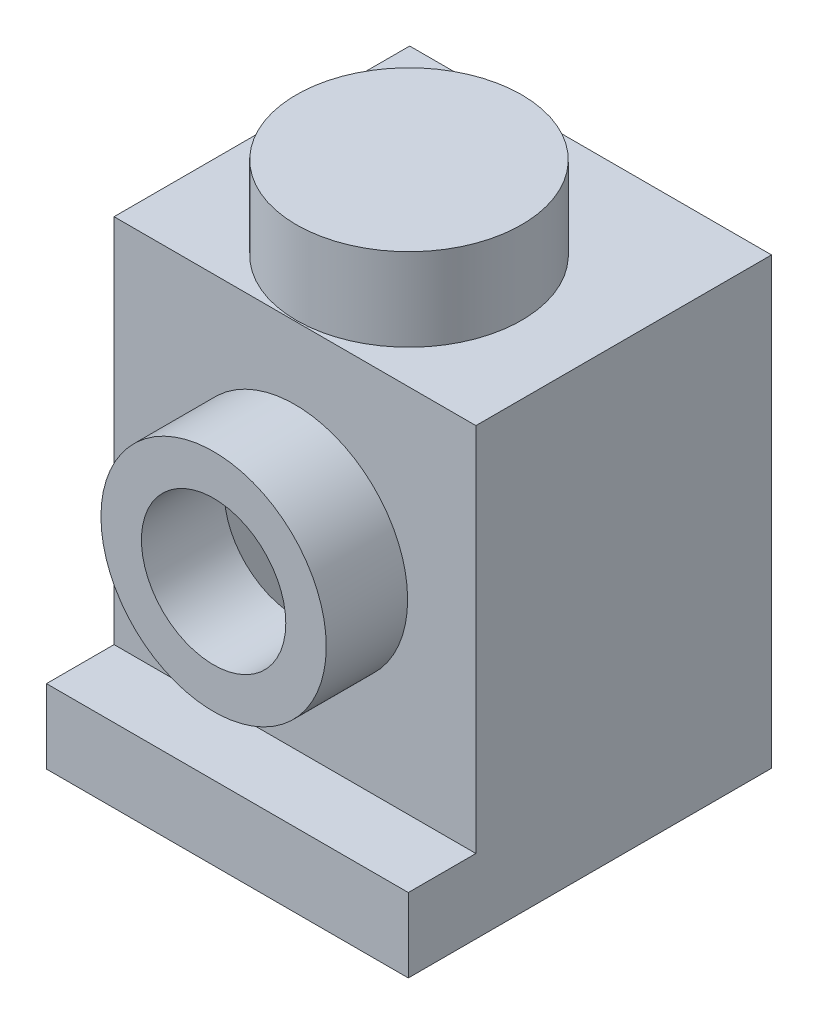
ISO-10303-21;
HEADER;
FILE_DESCRIPTION(('STEP AP214'),'2;1');
FILE_NAME('part.step','',(''),(''),'','','');
FILE_SCHEMA(('AUTOMOTIVE_DESIGN { 1 0 10303 214 1 1 1 1 }'));
ENDSEC;
DATA;
#1=APPLICATION_CONTEXT('core data for automotive mechanical design processes');
#2=APPLICATION_PROTOCOL_DEFINITION('international standard','automotive_design',2000,#1);
#3=PRODUCT_CONTEXT('',#1,'mechanical');
#4=PRODUCT('Part','Part','',(#3));
#5=PRODUCT_RELATED_PRODUCT_CATEGORY('part','',(#4));
#6=PRODUCT_DEFINITION_FORMATION('','',#4);
#7=PRODUCT_DEFINITION_CONTEXT('part definition',#1,'design');
#8=PRODUCT_DEFINITION('design','',#6,#7);
#9=PRODUCT_DEFINITION_SHAPE('','',#8);
#10=(LENGTH_UNIT() NAMED_UNIT(*) SI_UNIT(.MILLI.,.METRE.));
#11=(NAMED_UNIT(*) PLANE_ANGLE_UNIT() SI_UNIT($,.RADIAN.));
#12=(NAMED_UNIT(*) SI_UNIT($,.STERADIAN.) SOLID_ANGLE_UNIT());
#13=UNCERTAINTY_MEASURE_WITH_UNIT(LENGTH_MEASURE(1.E-05),#10,'distance_accuracy_value','');
#14=(GEOMETRIC_REPRESENTATION_CONTEXT(3) GLOBAL_UNCERTAINTY_ASSIGNED_CONTEXT((#13)) GLOBAL_UNIT_ASSIGNED_CONTEXT((#10,
#11,#12)) REPRESENTATION_CONTEXT('',''));
#15=CARTESIAN_POINT('',(0.,0.,0.));
#16=DIRECTION('',(0.,0.,1.));
#17=DIRECTION('',(1.,0.,0.));
#18=AXIS2_PLACEMENT_3D('',#15,#16,#17);
#19=CARTESIAN_POINT('',(-7.87,0.,7.9));
#20=DIRECTION('',(0.,-1.,0.));
#21=DIRECTION('',(0.,0.,-1.));
#22=AXIS2_PLACEMENT_3D('',#19,#20,#21);
#23=PLANE('',#22);
#24=DIRECTION('',(0.,0.,-1.));
#25=VECTOR('',#24,1.);
#26=CARTESIAN_POINT('',(-6.42,0.,1.5));
#27=LINE('',#26,#25);
#28=CARTESIAN_POINT('',(-6.42,0.,6.4));
#29=VERTEX_POINT('',#28);
#30=CARTESIAN_POINT('',(-6.42,0.,1.5));
#31=VERTEX_POINT('',#30);
#32=EDGE_CURVE('E48',#29,#31,#27,.T.);
#33=ORIENTED_EDGE('',*,*,#32,.F.);
#34=DIRECTION('',(-1.,0.,0.));
#35=VECTOR('',#34,1.);
#36=CARTESIAN_POINT('',(-6.42,0.,6.4));
#37=LINE('',#36,#35);
#38=CARTESIAN_POINT('',(-1.45,0.,6.4));
#39=VERTEX_POINT('',#38);
#40=EDGE_CURVE('E153',#39,#29,#37,.T.);
#41=ORIENTED_EDGE('',*,*,#40,.F.);
#42=DIRECTION('',(0.,0.,1.));
#43=VECTOR('',#42,1.);
#44=CARTESIAN_POINT('',(-1.45,0.,6.4));
#45=LINE('',#44,#43);
#46=CARTESIAN_POINT('',(-1.45,0.,1.5));
#47=VERTEX_POINT('',#46);
#48=EDGE_CURVE('E156',#47,#39,#45,.T.);
#49=ORIENTED_EDGE('',*,*,#48,.F.);
#50=DIRECTION('',(1.,0.,0.));
#51=VECTOR('',#50,1.);
#52=CARTESIAN_POINT('',(-1.45,0.,1.5));
#53=LINE('',#52,#51);
#54=EDGE_CURVE('E165',#31,#47,#53,.T.);
#55=ORIENTED_EDGE('',*,*,#54,.F.);
#56=EDGE_LOOP('',(#33,#41,#49,#55));
#57=FACE_BOUND('',#56,.T.);
#58=DIRECTION('',(0.,0.,-1.));
#59=VECTOR('',#58,1.);
#60=CARTESIAN_POINT('',(0.,0.,7.9));
#61=LINE('',#60,#59);
#62=CARTESIAN_POINT('',(0.,0.,7.9));
#63=VERTEX_POINT('',#62);
#64=CARTESIAN_POINT('',(0.,0.,0.));
#65=VERTEX_POINT('',#64);
#66=EDGE_CURVE('E213',#63,#65,#61,.T.);
#67=ORIENTED_EDGE('',*,*,#66,.F.);
#68=DIRECTION('',(1.,0.,0.));
#69=VECTOR('',#68,1.);
#70=CARTESIAN_POINT('',(-7.87,0.,7.9));
#71=LINE('',#70,#69);
#72=CARTESIAN_POINT('',(-7.87,0.,7.9));
#73=VERTEX_POINT('',#72);
#74=EDGE_CURVE('E216',#73,#63,#71,.T.);
#75=ORIENTED_EDGE('',*,*,#74,.F.);
#76=DIRECTION('',(0.,0.,-1.));
#77=VECTOR('',#76,1.);
#78=CARTESIAN_POINT('',(-7.87,0.,7.9));
#79=LINE('',#78,#77);
#80=CARTESIAN_POINT('',(-7.87,0.,0.));
#81=VERTEX_POINT('',#80);
#82=EDGE_CURVE('E217',#73,#81,#79,.T.);
#83=ORIENTED_EDGE('',*,*,#82,.T.);
#84=DIRECTION('',(1.,0.,0.));
#85=VECTOR('',#84,1.);
#86=CARTESIAN_POINT('',(-7.87,0.,0.));
#87=LINE('',#86,#85);
#88=EDGE_CURVE('E236',#81,#65,#87,.T.);
#89=ORIENTED_EDGE('',*,*,#88,.T.);
#90=EDGE_LOOP('',(#67,#75,#83,#89));
#91=FACE_BOUND('',#90,.T.);
#92=ADVANCED_FACE('F33',(#57,#91),#23,.T.);
#93=CARTESIAN_POINT('',(-7.87,1.61,7.9));
#94=DIRECTION('',(0.,0.,1.));
#95=DIRECTION('',(1.,0.,0.));
#96=AXIS2_PLACEMENT_3D('',#93,#94,#95);
#97=PLANE('',#96);
#98=DIRECTION('',(0.,-1.,0.));
#99=VECTOR('',#98,1.);
#100=CARTESIAN_POINT('',(0.,1.61,7.9));
#101=LINE('',#100,#99);
#102=CARTESIAN_POINT('',(0.,1.61,7.9));
#103=VERTEX_POINT('',#102);
#104=EDGE_CURVE('E221',#103,#63,#101,.T.);
#105=ORIENTED_EDGE('',*,*,#104,.F.);
#106=DIRECTION('',(1.,0.,0.));
#107=VECTOR('',#106,1.);
#108=CARTESIAN_POINT('',(-7.87,1.61,7.9));
#109=LINE('',#108,#107);
#110=CARTESIAN_POINT('',(-7.87,1.61,7.9));
#111=VERTEX_POINT('',#110);
#112=EDGE_CURVE('E254',#111,#103,#109,.T.);
#113=ORIENTED_EDGE('',*,*,#112,.F.);
#114=DIRECTION('',(0.,-1.,0.));
#115=VECTOR('',#114,1.);
#116=CARTESIAN_POINT('',(-7.87,1.61,7.9));
#117=LINE('',#116,#115);
#118=EDGE_CURVE('E233',#111,#73,#117,.T.);
#119=ORIENTED_EDGE('',*,*,#118,.T.);
#120=ORIENTED_EDGE('',*,*,#74,.T.);
#121=EDGE_LOOP('',(#105,#113,#119,#120));
#122=FACE_BOUND('',#121,.T.);
#123=ADVANCED_FACE('F275',(#122),#97,.T.);
#124=CARTESIAN_POINT('',(-7.87,1.61,6.43));
#125=DIRECTION('',(0.,1.,0.));
#126=DIRECTION('',(0.,0.,1.));
#127=AXIS2_PLACEMENT_3D('',#124,#125,#126);
#128=PLANE('',#127);
#129=DIRECTION('',(0.,0.,1.));
#130=VECTOR('',#129,1.);
#131=CARTESIAN_POINT('',(0.,1.61,6.43));
#132=LINE('',#131,#130);
#133=CARTESIAN_POINT('',(0.,1.61,6.43));
#134=VERTEX_POINT('',#133);
#135=EDGE_CURVE('E248',#134,#103,#132,.T.);
#136=ORIENTED_EDGE('',*,*,#135,.F.);
#137=DIRECTION('',(1.,0.,0.));
#138=VECTOR('',#137,1.);
#139=CARTESIAN_POINT('',(-7.87,1.61,6.43));
#140=LINE('',#139,#138);
#141=CARTESIAN_POINT('',(-7.87,1.61,6.43));
#142=VERTEX_POINT('',#141);
#143=EDGE_CURVE('E256',#142,#134,#140,.T.);
#144=ORIENTED_EDGE('',*,*,#143,.F.);
#145=DIRECTION('',(0.,0.,1.));
#146=VECTOR('',#145,1.);
#147=CARTESIAN_POINT('',(-7.87,1.61,6.43));
#148=LINE('',#147,#146);
#149=EDGE_CURVE('E230',#142,#111,#148,.T.);
#150=ORIENTED_EDGE('',*,*,#149,.T.);
#151=ORIENTED_EDGE('',*,*,#112,.T.);
#152=EDGE_LOOP('',(#136,#144,#150,#151));
#153=FACE_BOUND('',#152,.T.);
#154=ADVANCED_FACE('F288',(#153),#128,.T.);
#155=CARTESIAN_POINT('',(-7.87,9.67,6.43));
#156=DIRECTION('',(0.,0.,1.));
#157=DIRECTION('',(0.,-1.,0.));
#158=AXIS2_PLACEMENT_3D('',#155,#156,#157);
#159=PLANE('',#158);
#160=CARTESIAN_POINT('',(-3.935,5.65,6.43));
#161=DIRECTION('',(0.,0.,1.));
#162=DIRECTION('',(1.,0.,0.));
#163=AXIS2_PLACEMENT_3D('',#160,#161,#162);
#164=CIRCLE('',#163,2.45);
#165=CARTESIAN_POINT('',(-1.485,5.65,6.43));
#166=VERTEX_POINT('',#165);
#167=EDGE_CURVE('E204',#166,#166,#164,.T.);
#168=ORIENTED_EDGE('',*,*,#167,.F.);
#169=EDGE_LOOP('',(#168));
#170=FACE_BOUND('',#169,.T.);
#171=DIRECTION('',(0.,-1.,0.));
#172=VECTOR('',#171,1.);
#173=CARTESIAN_POINT('',(0.,9.67,6.43));
#174=LINE('',#173,#172);
#175=CARTESIAN_POINT('',(0.,9.67,6.43));
#176=VERTEX_POINT('',#175);
#177=EDGE_CURVE('E245',#176,#134,#174,.T.);
#178=ORIENTED_EDGE('',*,*,#177,.F.);
#179=DIRECTION('',(1.,0.,0.));
#180=VECTOR('',#179,1.);
#181=CARTESIAN_POINT('',(-7.87,9.67,6.43));
#182=LINE('',#181,#180);
#183=CARTESIAN_POINT('',(-7.87,9.67,6.43));
#184=VERTEX_POINT('',#183);
#185=EDGE_CURVE('E258',#184,#176,#182,.T.);
#186=ORIENTED_EDGE('',*,*,#185,.F.);
#187=DIRECTION('',(0.,-1.,0.));
#188=VECTOR('',#187,1.);
#189=CARTESIAN_POINT('',(-7.87,9.67,6.43));
#190=LINE('',#189,#188);
#191=EDGE_CURVE('E227',#184,#142,#190,.T.);
#192=ORIENTED_EDGE('',*,*,#191,.T.);
#193=ORIENTED_EDGE('',*,*,#143,.T.);
#194=EDGE_LOOP('',(#178,#186,#192,#193));
#195=FACE_BOUND('',#194,.T.);
#196=ADVANCED_FACE('F286',(#170,#195),#159,.T.);
#197=CARTESIAN_POINT('',(-7.87,9.67,0.));
#198=DIRECTION('',(0.,1.,0.));
#199=DIRECTION('',(0.,0.,1.));
#200=AXIS2_PLACEMENT_3D('',#197,#198,#199);
#201=PLANE('',#200);
#202=CARTESIAN_POINT('',(-3.935,9.67,3.95));
#203=DIRECTION('',(0.,1.,0.));
#204=DIRECTION('',(0.,0.,1.));
#205=AXIS2_PLACEMENT_3D('',#202,#203,#204);
#206=CIRCLE('',#205,2.45);
#207=CARTESIAN_POINT('',(-3.935,9.67,6.4));
#208=VERTEX_POINT('',#207);
#209=EDGE_CURVE('E41',#208,#208,#206,.T.);
#210=ORIENTED_EDGE('',*,*,#209,.F.);
#211=EDGE_LOOP('',(#210));
#212=FACE_BOUND('',#211,.T.);
#213=DIRECTION('',(0.,0.,1.));
#214=VECTOR('',#213,1.);
#215=CARTESIAN_POINT('',(0.,9.67,0.));
#216=LINE('',#215,#214);
#217=CARTESIAN_POINT('',(0.,9.67,0.));
#218=VERTEX_POINT('',#217);
#219=EDGE_CURVE('E242',#218,#176,#216,.T.);
#220=ORIENTED_EDGE('',*,*,#219,.F.);
#221=DIRECTION('',(1.,0.,0.));
#222=VECTOR('',#221,1.);
#223=CARTESIAN_POINT('',(-7.87,9.67,0.));
#224=LINE('',#223,#222);
#225=CARTESIAN_POINT('',(-7.87,9.67,0.));
#226=VERTEX_POINT('',#225);
#227=EDGE_CURVE('E260',#226,#218,#224,.T.);
#228=ORIENTED_EDGE('',*,*,#227,.F.);
#229=DIRECTION('',(0.,0.,1.));
#230=VECTOR('',#229,1.);
#231=CARTESIAN_POINT('',(-7.87,9.67,0.));
#232=LINE('',#231,#230);
#233=EDGE_CURVE('E224',#226,#184,#232,.T.);
#234=ORIENTED_EDGE('',*,*,#233,.T.);
#235=ORIENTED_EDGE('',*,*,#185,.T.);
#236=EDGE_LOOP('',(#220,#228,#234,#235));
#237=FACE_BOUND('',#236,.T.);
#238=ADVANCED_FACE('F283',(#212,#237),#201,.T.);
#239=CARTESIAN_POINT('',(-7.87,0.,0.));
#240=DIRECTION('',(0.,0.,-1.));
#241=DIRECTION('',(-1.,0.,0.));
#242=AXIS2_PLACEMENT_3D('',#239,#240,#241);
#243=PLANE('',#242);
#244=DIRECTION('',(0.,-1.,0.));
#245=VECTOR('',#244,1.);
#246=CARTESIAN_POINT('',(-1.5,3.3,0.));
#247=LINE('',#246,#245);
#248=CARTESIAN_POINT('',(-1.5,8.11,0.));
#249=VERTEX_POINT('',#248);
#250=CARTESIAN_POINT('',(-1.5,3.3,0.));
#251=VERTEX_POINT('',#250);
#252=EDGE_CURVE('E181',#249,#251,#247,.T.);
#253=ORIENTED_EDGE('',*,*,#252,.F.);
#254=DIRECTION('',(1.,0.,0.));
#255=VECTOR('',#254,1.);
#256=CARTESIAN_POINT('',(-1.5,8.11,0.));
#257=LINE('',#256,#255);
#258=CARTESIAN_POINT('',(-6.37,8.11,0.));
#259=VERTEX_POINT('',#258);
#260=EDGE_CURVE('E190',#259,#249,#257,.T.);
#261=ORIENTED_EDGE('',*,*,#260,.F.);
#262=DIRECTION('',(0.,1.,0.));
#263=VECTOR('',#262,1.);
#264=CARTESIAN_POINT('',(-6.37,8.11,0.));
#265=LINE('',#264,#263);
#266=CARTESIAN_POINT('',(-6.37,3.3,0.));
#267=VERTEX_POINT('',#266);
#268=EDGE_CURVE('E187',#267,#259,#265,.T.);
#269=ORIENTED_EDGE('',*,*,#268,.F.);
#270=DIRECTION('',(-1.,0.,0.));
#271=VECTOR('',#270,1.);
#272=CARTESIAN_POINT('',(-6.37,3.3,0.));
#273=LINE('',#272,#271);
#274=EDGE_CURVE('E184',#251,#267,#273,.T.);
#275=ORIENTED_EDGE('',*,*,#274,.F.);
#276=EDGE_LOOP('',(#253,#261,#269,#275));
#277=FACE_BOUND('',#276,.T.);
#278=DIRECTION('',(0.,1.,0.));
#279=VECTOR('',#278,1.);
#280=CARTESIAN_POINT('',(0.,0.,0.));
#281=LINE('',#280,#279);
#282=EDGE_CURVE('E239',#65,#218,#281,.T.);
#283=ORIENTED_EDGE('',*,*,#282,.F.);
#284=ORIENTED_EDGE('',*,*,#88,.F.);
#285=DIRECTION('',(0.,1.,0.));
#286=VECTOR('',#285,1.);
#287=CARTESIAN_POINT('',(-7.87,0.,0.));
#288=LINE('',#287,#286);
#289=EDGE_CURVE('E220',#81,#226,#288,.T.);
#290=ORIENTED_EDGE('',*,*,#289,.T.);
#291=ORIENTED_EDGE('',*,*,#227,.T.);
#292=EDGE_LOOP('',(#283,#284,#290,#291));
#293=FACE_BOUND('',#292,.T.);
#294=ADVANCED_FACE('F268',(#277,#293),#243,.T.);
#295=CARTESIAN_POINT('',(-7.87,0.,0.));
#296=DIRECTION('',(1.,0.,0.));
#297=DIRECTION('',(0.,0.,-1.));
#298=AXIS2_PLACEMENT_3D('',#295,#296,#297);
#299=PLANE('',#298);
#300=ORIENTED_EDGE('',*,*,#82,.F.);
#301=ORIENTED_EDGE('',*,*,#118,.F.);
#302=ORIENTED_EDGE('',*,*,#149,.F.);
#303=ORIENTED_EDGE('',*,*,#191,.F.);
#304=ORIENTED_EDGE('',*,*,#233,.F.);
#305=ORIENTED_EDGE('',*,*,#289,.F.);
#306=EDGE_LOOP('',(#300,#301,#302,#303,#304,#305));
#307=FACE_BOUND('',#306,.T.);
#308=ADVANCED_FACE('F278',(#307),#299,.F.);
#309=CARTESIAN_POINT('',(0.,0.,0.));
#310=DIRECTION('',(1.,0.,0.));
#311=DIRECTION('',(0.,0.,-1.));
#312=AXIS2_PLACEMENT_3D('',#309,#310,#311);
#313=PLANE('',#312);
#314=ORIENTED_EDGE('',*,*,#66,.T.);
#315=ORIENTED_EDGE('',*,*,#282,.T.);
#316=ORIENTED_EDGE('',*,*,#219,.T.);
#317=ORIENTED_EDGE('',*,*,#177,.T.);
#318=ORIENTED_EDGE('',*,*,#135,.T.);
#319=ORIENTED_EDGE('',*,*,#104,.T.);
#320=EDGE_LOOP('',(#314,#315,#316,#317,#318,#319));
#321=FACE_BOUND('',#320,.T.);
#322=ADVANCED_FACE('F271',(#321),#313,.T.);
#323=CARTESIAN_POINT('',(-3.935,11.47,3.95));
#324=DIRECTION('',(0.,-1.,0.));
#325=DIRECTION('',(0.,0.,-1.));
#326=AXIS2_PLACEMENT_3D('',#323,#324,#325);
#327=CYLINDRICAL_SURFACE('',#326,2.45);
#328=CARTESIAN_POINT('',(-3.935,11.47,3.95));
#329=DIRECTION('',(0.,1.,0.));
#330=DIRECTION('',(0.,0.,1.));
#331=AXIS2_PLACEMENT_3D('',#328,#329,#330);
#332=CIRCLE('',#331,2.45);
#333=CARTESIAN_POINT('',(-3.935,11.47,6.4));
#334=VERTEX_POINT('',#333);
#335=EDGE_CURVE('E208',#334,#334,#332,.T.);
#336=ORIENTED_EDGE('',*,*,#335,.F.);
#337=EDGE_LOOP('',(#336));
#338=FACE_BOUND('',#337,.T.);
#339=ORIENTED_EDGE('',*,*,#209,.T.);
#340=EDGE_LOOP('',(#339));
#341=FACE_BOUND('',#340,.T.);
#342=ADVANCED_FACE('F357',(#338,#341),#327,.T.);
#343=CARTESIAN_POINT('',(-3.935,11.47,3.95));
#344=DIRECTION('',(0.,1.,0.));
#345=DIRECTION('',(0.,0.,1.));
#346=AXIS2_PLACEMENT_3D('',#343,#344,#345);
#347=PLANE('',#346);
#348=ORIENTED_EDGE('',*,*,#335,.T.);
#349=EDGE_LOOP('',(#348));
#350=FACE_BOUND('',#349,.T.);
#351=ADVANCED_FACE('F350',(#350),#347,.T.);
#352=CARTESIAN_POINT('',(-3.935,5.65,8.2));
#353=DIRECTION('',(0.,0.,1.));
#354=DIRECTION('',(1.,0.,0.));
#355=AXIS2_PLACEMENT_3D('',#352,#353,#354);
#356=PLANE('',#355);
#357=CARTESIAN_POINT('',(-3.935,5.65,8.2));
#358=DIRECTION('',(0.,0.,1.));
#359=DIRECTION('',(1.,0.,0.));
#360=AXIS2_PLACEMENT_3D('',#357,#358,#359);
#361=CIRCLE('',#360,2.45);
#362=CARTESIAN_POINT('',(-1.485,5.65,8.2));
#363=VERTEX_POINT('',#362);
#364=EDGE_CURVE('E205',#363,#363,#361,.T.);
#365=ORIENTED_EDGE('',*,*,#364,.T.);
#366=EDGE_LOOP('',(#365));
#367=FACE_BOUND('',#366,.T.);
#368=CARTESIAN_POINT('',(-3.935,5.65,8.2));
#369=DIRECTION('',(0.,0.,1.));
#370=DIRECTION('',(1.,0.,0.));
#371=AXIS2_PLACEMENT_3D('',#368,#369,#370);
#372=CIRCLE('',#371,1.57);
#373=CARTESIAN_POINT('',(-2.365,5.65,8.2));
#374=VERTEX_POINT('',#373);
#375=EDGE_CURVE('E196',#374,#374,#372,.T.);
#376=ORIENTED_EDGE('',*,*,#375,.F.);
#377=EDGE_LOOP('',(#376));
#378=FACE_BOUND('',#377,.T.);
#379=ADVANCED_FACE('F347',(#367,#378),#356,.T.);
#380=CARTESIAN_POINT('',(-3.935,5.65,8.2));
#381=DIRECTION('',(0.,0.,-1.));
#382=DIRECTION('',(-1.,0.,0.));
#383=AXIS2_PLACEMENT_3D('',#380,#381,#382);
#384=CYLINDRICAL_SURFACE('',#383,2.45);
#385=ORIENTED_EDGE('',*,*,#364,.F.);
#386=EDGE_LOOP('',(#385));
#387=FACE_BOUND('',#386,.T.);
#388=ORIENTED_EDGE('',*,*,#167,.T.);
#389=EDGE_LOOP('',(#388));
#390=FACE_BOUND('',#389,.T.);
#391=ADVANCED_FACE('F345',(#387,#390),#384,.T.);
#392=CARTESIAN_POINT('',(-3.935,5.65,8.2));
#393=DIRECTION('',(0.,0.,-1.));
#394=DIRECTION('',(-1.,0.,0.));
#395=AXIS2_PLACEMENT_3D('',#392,#393,#394);
#396=CYLINDRICAL_SURFACE('',#395,1.57);
#397=CARTESIAN_POINT('',(-3.935,5.65,6.4));
#398=DIRECTION('',(0.,0.,1.));
#399=DIRECTION('',(1.,0.,0.));
#400=AXIS2_PLACEMENT_3D('',#397,#398,#399);
#401=CIRCLE('',#400,1.57);
#402=CARTESIAN_POINT('',(-2.365,5.65,6.4));
#403=VERTEX_POINT('',#402);
#404=EDGE_CURVE('E36',#403,#403,#401,.T.);
#405=ORIENTED_EDGE('',*,*,#404,.F.);
#406=EDGE_LOOP('',(#405));
#407=FACE_BOUND('',#406,.T.);
#408=ORIENTED_EDGE('',*,*,#375,.T.);
#409=EDGE_LOOP('',(#408));
#410=FACE_BOUND('',#409,.T.);
#411=ADVANCED_FACE('F341',(#407,#410),#396,.F.);
#412=CARTESIAN_POINT('',(-1.5,3.3,4.92));
#413=DIRECTION('',(1.,0.,0.));
#414=DIRECTION('',(0.,1.,0.));
#415=AXIS2_PLACEMENT_3D('',#412,#413,#414);
#416=PLANE('',#415);
#417=DIRECTION('',(0.,0.,-1.));
#418=VECTOR('',#417,1.);
#419=CARTESIAN_POINT('',(-1.5,3.3,4.92));
#420=LINE('',#419,#418);
#421=CARTESIAN_POINT('',(-1.5,3.3,1.5));
#422=VERTEX_POINT('',#421);
#423=EDGE_CURVE('E193',#422,#251,#420,.T.);
#424=ORIENTED_EDGE('',*,*,#423,.F.);
#425=DIRECTION('',(0.,1.,0.));
#426=VECTOR('',#425,1.);
#427=CARTESIAN_POINT('',(-1.5,3.3,1.5));
#428=LINE('',#427,#426);
#429=CARTESIAN_POINT('',(-1.5,8.11,1.5));
#430=VERTEX_POINT('',#429);
#431=EDGE_CURVE('E56',#422,#430,#428,.T.);
#432=ORIENTED_EDGE('',*,*,#431,.T.);
#433=DIRECTION('',(0.,0.,-1.));
#434=VECTOR('',#433,1.);
#435=CARTESIAN_POINT('',(-1.5,8.11,4.92));
#436=LINE('',#435,#434);
#437=EDGE_CURVE('E194',#430,#249,#436,.T.);
#438=ORIENTED_EDGE('',*,*,#437,.T.);
#439=ORIENTED_EDGE('',*,*,#252,.T.);
#440=EDGE_LOOP('',(#424,#432,#438,#439));
#441=FACE_BOUND('',#440,.T.);
#442=ADVANCED_FACE('F331',(#441),#416,.F.);
#443=CARTESIAN_POINT('',(-1.5,8.11,4.92));
#444=DIRECTION('',(0.,1.,0.));
#445=DIRECTION('',(0.,0.,1.));
#446=AXIS2_PLACEMENT_3D('',#443,#444,#445);
#447=PLANE('',#446);
#448=ORIENTED_EDGE('',*,*,#437,.F.);
#449=DIRECTION('',(-1.,0.,0.));
#450=VECTOR('',#449,1.);
#451=CARTESIAN_POINT('',(-1.5,8.11,1.5));
#452=LINE('',#451,#450);
#453=CARTESIAN_POINT('',(-6.37,8.11,1.5));
#454=VERTEX_POINT('',#453);
#455=EDGE_CURVE('E177',#430,#454,#452,.T.);
#456=ORIENTED_EDGE('',*,*,#455,.T.);
#457=DIRECTION('',(0.,0.,-1.));
#458=VECTOR('',#457,1.);
#459=CARTESIAN_POINT('',(-6.37,8.11,4.92));
#460=LINE('',#459,#458);
#461=EDGE_CURVE('E197',#454,#259,#460,.T.);
#462=ORIENTED_EDGE('',*,*,#461,.T.);
#463=ORIENTED_EDGE('',*,*,#260,.T.);
#464=EDGE_LOOP('',(#448,#456,#462,#463));
#465=FACE_BOUND('',#464,.T.);
#466=ADVANCED_FACE('F327',(#465),#447,.F.);
#467=CARTESIAN_POINT('',(-6.37,8.11,4.92));
#468=DIRECTION('',(-1.,0.,0.));
#469=DIRECTION('',(0.,-1.,0.));
#470=AXIS2_PLACEMENT_3D('',#467,#468,#469);
#471=PLANE('',#470);
#472=ORIENTED_EDGE('',*,*,#461,.F.);
#473=DIRECTION('',(0.,-1.,0.));
#474=VECTOR('',#473,1.);
#475=CARTESIAN_POINT('',(-6.37,8.11,1.5));
#476=LINE('',#475,#474);
#477=CARTESIAN_POINT('',(-6.37,3.3,1.5));
#478=VERTEX_POINT('',#477);
#479=EDGE_CURVE('E171',#454,#478,#476,.T.);
#480=ORIENTED_EDGE('',*,*,#479,.T.);
#481=DIRECTION('',(0.,0.,-1.));
#482=VECTOR('',#481,1.);
#483=CARTESIAN_POINT('',(-6.37,3.3,4.92));
#484=LINE('',#483,#482);
#485=EDGE_CURVE('E199',#478,#267,#484,.T.);
#486=ORIENTED_EDGE('',*,*,#485,.T.);
#487=ORIENTED_EDGE('',*,*,#268,.T.);
#488=EDGE_LOOP('',(#472,#480,#486,#487));
#489=FACE_BOUND('',#488,.T.);
#490=ADVANCED_FACE('F330',(#489),#471,.F.);
#491=CARTESIAN_POINT('',(-6.37,3.3,4.92));
#492=DIRECTION('',(0.,-1.,0.));
#493=DIRECTION('',(1.,0.,0.));
#494=AXIS2_PLACEMENT_3D('',#491,#492,#493);
#495=PLANE('',#494);
#496=ORIENTED_EDGE('',*,*,#485,.F.);
#497=DIRECTION('',(1.,0.,0.));
#498=VECTOR('',#497,1.);
#499=CARTESIAN_POINT('',(-6.37,3.3,1.5));
#500=LINE('',#499,#498);
#501=EDGE_CURVE('E11',#478,#422,#500,.T.);
#502=ORIENTED_EDGE('',*,*,#501,.T.);
#503=ORIENTED_EDGE('',*,*,#423,.T.);
#504=ORIENTED_EDGE('',*,*,#274,.T.);
#505=EDGE_LOOP('',(#496,#502,#503,#504));
#506=FACE_BOUND('',#505,.T.);
#507=ADVANCED_FACE('F325',(#506),#495,.F.);
#508=CARTESIAN_POINT('',(-1.45,8.81,1.5));
#509=DIRECTION('',(0.,0.,-1.));
#510=DIRECTION('',(-1.,0.,0.));
#511=AXIS2_PLACEMENT_3D('',#508,#509,#510);
#512=PLANE('',#511);
#513=ORIENTED_EDGE('',*,*,#54,.T.);
#514=DIRECTION('',(0.,-1.,0.));
#515=VECTOR('',#514,1.);
#516=CARTESIAN_POINT('',(-1.45,8.81,1.5));
#517=LINE('',#516,#515);
#518=CARTESIAN_POINT('',(-1.45,8.81,1.5));
#519=VERTEX_POINT('',#518);
#520=EDGE_CURVE('E140',#519,#47,#517,.T.);
#521=ORIENTED_EDGE('',*,*,#520,.F.);
#522=DIRECTION('',(1.,0.,0.));
#523=VECTOR('',#522,1.);
#524=CARTESIAN_POINT('',(-1.45,8.81,1.5));
#525=LINE('',#524,#523);
#526=CARTESIAN_POINT('',(-6.42,8.81,1.5));
#527=VERTEX_POINT('',#526);
#528=EDGE_CURVE('E144',#527,#519,#525,.T.);
#529=ORIENTED_EDGE('',*,*,#528,.F.);
#530=DIRECTION('',(0.,-1.,0.));
#531=VECTOR('',#530,1.);
#532=CARTESIAN_POINT('',(-6.42,8.81,1.5));
#533=LINE('',#532,#531);
#534=EDGE_CURVE('E131',#527,#31,#533,.T.);
#535=ORIENTED_EDGE('',*,*,#534,.T.);
#536=EDGE_LOOP('',(#513,#521,#529,#535));
#537=FACE_BOUND('',#536,.T.);
#538=ORIENTED_EDGE('',*,*,#501,.F.);
#539=ORIENTED_EDGE('',*,*,#479,.F.);
#540=ORIENTED_EDGE('',*,*,#455,.F.);
#541=ORIENTED_EDGE('',*,*,#431,.F.);
#542=EDGE_LOOP('',(#538,#539,#540,#541));
#543=FACE_BOUND('',#542,.T.);
#544=ADVANCED_FACE('F145',(#537,#543),#512,.F.);
#545=CARTESIAN_POINT('',(-6.42,8.81,1.5));
#546=DIRECTION('',(-1.,0.,0.));
#547=DIRECTION('',(0.,0.,1.));
#548=AXIS2_PLACEMENT_3D('',#545,#546,#547);
#549=PLANE('',#548);
#550=ORIENTED_EDGE('',*,*,#32,.T.);
#551=ORIENTED_EDGE('',*,*,#534,.F.);
#552=DIRECTION('',(0.,0.,-1.));
#553=VECTOR('',#552,1.);
#554=CARTESIAN_POINT('',(-6.42,8.81,1.5));
#555=LINE('',#554,#553);
#556=CARTESIAN_POINT('',(-6.42,8.81,6.4));
#557=VERTEX_POINT('',#556);
#558=EDGE_CURVE('E135',#557,#527,#555,.T.);
#559=ORIENTED_EDGE('',*,*,#558,.F.);
#560=DIRECTION('',(0.,-1.,0.));
#561=VECTOR('',#560,1.);
#562=CARTESIAN_POINT('',(-6.42,8.81,6.4));
#563=LINE('',#562,#561);
#564=EDGE_CURVE('E169',#557,#29,#563,.T.);
#565=ORIENTED_EDGE('',*,*,#564,.T.);
#566=EDGE_LOOP('',(#550,#551,#559,#565));
#567=FACE_BOUND('',#566,.T.);
#568=ADVANCED_FACE('F133',(#567),#549,.F.);
#569=CARTESIAN_POINT('',(-6.42,8.81,6.4));
#570=DIRECTION('',(0.,0.,1.));
#571=DIRECTION('',(1.,0.,0.));
#572=AXIS2_PLACEMENT_3D('',#569,#570,#571);
#573=PLANE('',#572);
#574=ORIENTED_EDGE('',*,*,#404,.T.);
#575=EDGE_LOOP('',(#574));
#576=FACE_BOUND('',#575,.T.);
#577=ORIENTED_EDGE('',*,*,#40,.T.);
#578=ORIENTED_EDGE('',*,*,#564,.F.);
#579=DIRECTION('',(-1.,0.,0.));
#580=VECTOR('',#579,1.);
#581=CARTESIAN_POINT('',(-6.42,8.81,6.4));
#582=LINE('',#581,#580);
#583=CARTESIAN_POINT('',(-1.45,8.81,6.4));
#584=VERTEX_POINT('',#583);
#585=EDGE_CURVE('E141',#584,#557,#582,.T.);
#586=ORIENTED_EDGE('',*,*,#585,.F.);
#587=DIRECTION('',(0.,-1.,0.));
#588=VECTOR('',#587,1.);
#589=CARTESIAN_POINT('',(-1.45,8.81,6.4));
#590=LINE('',#589,#588);
#591=EDGE_CURVE('E172',#584,#39,#590,.T.);
#592=ORIENTED_EDGE('',*,*,#591,.T.);
#593=EDGE_LOOP('',(#577,#578,#586,#592));
#594=FACE_BOUND('',#593,.T.);
#595=ADVANCED_FACE('F310',(#576,#594),#573,.F.);
#596=CARTESIAN_POINT('',(-1.45,8.81,6.4));
#597=DIRECTION('',(1.,0.,0.));
#598=DIRECTION('',(0.,0.,-1.));
#599=AXIS2_PLACEMENT_3D('',#596,#597,#598);
#600=PLANE('',#599);
#601=ORIENTED_EDGE('',*,*,#48,.T.);
#602=ORIENTED_EDGE('',*,*,#591,.F.);
#603=DIRECTION('',(0.,0.,1.));
#604=VECTOR('',#603,1.);
#605=CARTESIAN_POINT('',(-1.45,8.81,6.4));
#606=LINE('',#605,#604);
#607=EDGE_CURVE('E149',#519,#584,#606,.T.);
#608=ORIENTED_EDGE('',*,*,#607,.F.);
#609=ORIENTED_EDGE('',*,*,#520,.T.);
#610=EDGE_LOOP('',(#601,#602,#608,#609));
#611=FACE_BOUND('',#610,.T.);
#612=ADVANCED_FACE('F308',(#611),#600,.F.);
#613=CARTESIAN_POINT('',(0.,8.81,0.));
#614=DIRECTION('',(0.,1.,0.));
#615=DIRECTION('',(0.,0.,1.));
#616=AXIS2_PLACEMENT_3D('',#613,#614,#615);
#617=PLANE('',#616);
#618=CARTESIAN_POINT('',(-3.935,8.81,3.95));
#619=DIRECTION('',(0.,1.,0.));
#620=DIRECTION('',(0.,0.,1.));
#621=AXIS2_PLACEMENT_3D('',#618,#619,#620);
#622=CIRCLE('',#621,0.950000000000001);
#623=CARTESIAN_POINT('',(-3.935,8.81,4.9));
#624=VERTEX_POINT('',#623);
#625=EDGE_CURVE('E159',#624,#624,#622,.T.);
#626=ORIENTED_EDGE('',*,*,#625,.T.);
#627=EDGE_LOOP('',(#626));
#628=FACE_BOUND('',#627,.T.);
#629=ORIENTED_EDGE('',*,*,#558,.T.);
#630=ORIENTED_EDGE('',*,*,#528,.T.);
#631=ORIENTED_EDGE('',*,*,#607,.T.);
#632=ORIENTED_EDGE('',*,*,#585,.T.);
#633=EDGE_LOOP('',(#629,#630,#631,#632));
#634=FACE_BOUND('',#633,.T.);
#635=ADVANCED_FACE('F151',(#628,#634),#617,.F.);
#636=CARTESIAN_POINT('',(-3.935,11.47,3.95));
#637=DIRECTION('',(0.,-1.,0.));
#638=DIRECTION('',(0.,0.,-1.));
#639=AXIS2_PLACEMENT_3D('',#636,#637,#638);
#640=CYLINDRICAL_SURFACE('',#639,0.950000000000001);
#641=CARTESIAN_POINT('',(-3.935,9.97,3.95));
#642=DIRECTION('',(0.,1.,0.));
#643=DIRECTION('',(0.,0.,1.));
#644=AXIS2_PLACEMENT_3D('',#641,#642,#643);
#645=CIRCLE('',#644,0.950000000000001);
#646=CARTESIAN_POINT('',(-3.935,9.97,4.9));
#647=VERTEX_POINT('',#646);
#648=EDGE_CURVE('E458',#647,#647,#645,.T.);
#649=ORIENTED_EDGE('',*,*,#648,.T.);
#650=EDGE_LOOP('',(#649));
#651=FACE_BOUND('',#650,.T.);
#652=ORIENTED_EDGE('',*,*,#625,.F.);
#653=EDGE_LOOP('',(#652));
#654=FACE_BOUND('',#653,.T.);
#655=ADVANCED_FACE('F382',(#651,#654),#640,.F.);
#656=CARTESIAN_POINT('',(-3.935,9.97,3.95));
#657=DIRECTION('',(0.,1.,0.));
#658=DIRECTION('',(0.,0.,1.));
#659=AXIS2_PLACEMENT_3D('',#656,#657,#658);
#660=PLANE('',#659);
#661=ORIENTED_EDGE('',*,*,#648,.F.);
#662=EDGE_LOOP('',(#661));
#663=FACE_BOUND('',#662,.T.);
#664=ADVANCED_FACE('F387',(#663),#660,.F.);
#665=CLOSED_SHELL('',(#92,#123,#154,#196,#238,#294,#308,#322,#342,#351,#379,#391,#411,#442,#466,
#490,#507,#544,#568,#595,#612,#635,#655,#664));
#666=MANIFOLD_SOLID_BREP('B2',#665);
#667=ADVANCED_BREP_SHAPE_REPRESENTATION('',(#18,#666),#14);
#668=SHAPE_DEFINITION_REPRESENTATION(#9,#667);
ENDSEC;
END-ISO-10303-21;
